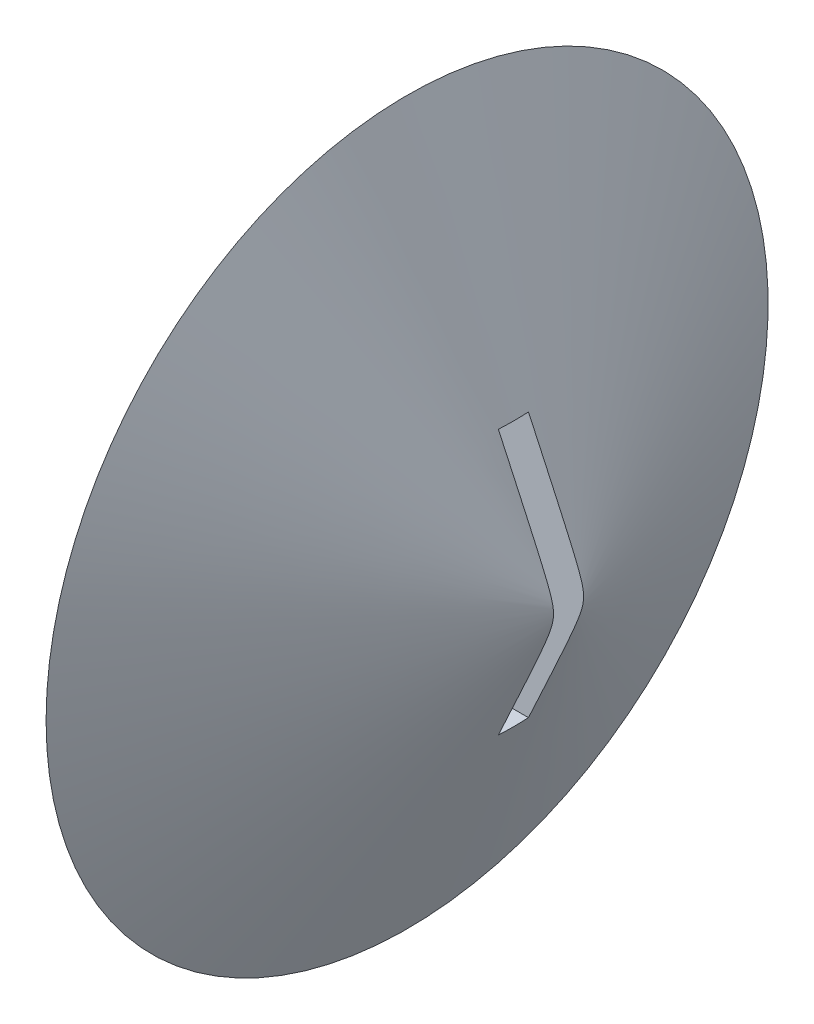
ISO-10303-21;
HEADER;
FILE_DESCRIPTION(('STEP AP214'),'2;1');
FILE_NAME('part.step','',(''),(''),'','','');
FILE_SCHEMA(('AUTOMOTIVE_DESIGN { 1 0 10303 214 1 1 1 1 }'));
ENDSEC;
DATA;
#1=APPLICATION_CONTEXT('core data for automotive mechanical design processes');
#2=APPLICATION_PROTOCOL_DEFINITION('international standard','automotive_design',2000,#1);
#3=PRODUCT_CONTEXT('',#1,'mechanical');
#4=PRODUCT('Part','Part','',(#3));
#5=PRODUCT_RELATED_PRODUCT_CATEGORY('part','',(#4));
#6=PRODUCT_DEFINITION_FORMATION('','',#4);
#7=PRODUCT_DEFINITION_CONTEXT('part definition',#1,'design');
#8=PRODUCT_DEFINITION('design','',#6,#7);
#9=PRODUCT_DEFINITION_SHAPE('','',#8);
#10=(LENGTH_UNIT() NAMED_UNIT(*) SI_UNIT(.MILLI.,.METRE.));
#11=(NAMED_UNIT(*) PLANE_ANGLE_UNIT() SI_UNIT($,.RADIAN.));
#12=(NAMED_UNIT(*) SI_UNIT($,.STERADIAN.) SOLID_ANGLE_UNIT());
#13=UNCERTAINTY_MEASURE_WITH_UNIT(LENGTH_MEASURE(1.E-05),#10,'distance_accuracy_value','');
#14=(GEOMETRIC_REPRESENTATION_CONTEXT(3) GLOBAL_UNCERTAINTY_ASSIGNED_CONTEXT((#13)) GLOBAL_UNIT_ASSIGNED_CONTEXT((#10,
#11,#12)) REPRESENTATION_CONTEXT('',''));
#15=CARTESIAN_POINT('',(0.,0.,0.));
#16=DIRECTION('',(0.,0.,1.));
#17=DIRECTION('',(1.,0.,0.));
#18=AXIS2_PLACEMENT_3D('',#15,#16,#17);
#19=CARTESIAN_POINT('',(0.,0.,0.));
#20=DIRECTION('',(-1.,0.,0.));
#21=DIRECTION('',(0.,0.,1.));
#22=AXIS2_PLACEMENT_3D('',#19,#20,#21);
#23=CONICAL_SURFACE('',#22,0.,1.13416916698135);
#24=CARTESIAN_POINT('',(-8.85895527265695,-11.,-15.4716626533279));
#25=CARTESIAN_POINT('',(-8.76318980882844,-11.,-15.2198639208516));
#26=CARTESIAN_POINT('',(-8.66810490329107,-11.,-14.9678065006942));
#27=CARTESIAN_POINT('',(-8.47946181835994,-11.,-14.4631174713571));
#28=CARTESIAN_POINT('',(-8.38590365871182,-11.,-14.2104858547992));
#29=CARTESIAN_POINT('',(-8.10773684473219,-11.,-13.4515599568466));
#30=CARTESIAN_POINT('',(-7.92567168343597,-11.,-12.9443284635024));
#31=CARTESIAN_POINT('',(-7.56898081356709,-11.,-11.9238783564628));
#32=CARTESIAN_POINT('',(-7.39440547335494,-11.,-11.4106420755648));
#33=CARTESIAN_POINT('',(-7.05613224127399,-11.,-10.3806026814141));
#34=CARTESIAN_POINT('',(-6.89243385618826,-11.,-9.86379973106732));
#35=CARTESIAN_POINT('',(-6.58145175902522,-11.,-8.83453622890365));
#36=CARTESIAN_POINT('',(-6.43394201138863,-11.,-8.32214445080386));
#37=CARTESIAN_POINT('',(-6.15588722354407,-11.,-7.29270656302532));
#38=CARTESIAN_POINT('',(-6.02534296286313,-11.,-6.77566024064676));
#39=CARTESIAN_POINT('',(-5.7858664730821,-11.,-5.73763916405068));
#40=CARTESIAN_POINT('',(-5.67689061046046,-11.,-5.21667460086214));
#41=CARTESIAN_POINT('',(-5.48521409906819,-11.,-4.16995381410837));
#42=CARTESIAN_POINT('',(-5.40250761711072,-11.,-3.64419868101271));
#43=CARTESIAN_POINT('',(-5.28056355059164,-11.,-2.68556253949501));
#44=CARTESIAN_POINT('',(-5.23613386207937,-11.,-2.25334611051981));
#45=CARTESIAN_POINT('',(-5.17014854495112,-11.,-1.38715886160389));
#46=CARTESIAN_POINT('',(-5.14859174444251,-11.,-0.95318813268842));
#47=CARTESIAN_POINT('',(-5.12949465952195,-11.,-0.0847506933162061));
#48=CARTESIAN_POINT('',(-5.13195217115795,-11.,0.349715967966223));
#49=CARTESIAN_POINT('',(-5.1607435193223,-11.,1.21785416474329));
#50=CARTESIAN_POINT('',(-5.18707790965167,-11.,1.65152568156155));
#51=CARTESIAN_POINT('',(-5.26231365405107,-11.,2.51760640773556));
#52=CARTESIAN_POINT('',(-5.31125268841004,-11.,2.95001229149952));
#53=CARTESIAN_POINT('',(-5.42943350929907,-11.,3.81201629545816));
#54=CARTESIAN_POINT('',(-5.49867597642972,-11.,4.24161432103577));
#55=CARTESIAN_POINT('',(-5.65481301466331,-11.,5.0978687653656));
#56=CARTESIAN_POINT('',(-5.74172012659558,-11.,5.52452287036632));
#57=CARTESIAN_POINT('',(-5.93042025168073,-11.,6.37449417638525));
#58=CARTESIAN_POINT('',(-6.03221317114777,-11.,6.79781139838691));
#59=CARTESIAN_POINT('',(-6.23031163080642,-11.,7.57145018957933));
#60=CARTESIAN_POINT('',(-6.32473716150258,-11.,7.9222576861184));
#61=CARTESIAN_POINT('',(-6.52094766544677,-11.,8.62181715282795));
#62=CARTESIAN_POINT('',(-6.62273292546839,-11.,8.97056904232796));
#63=CARTESIAN_POINT('',(-6.83251048189482,-11.,9.66602236172689));
#64=CARTESIAN_POINT('',(-6.94049995956332,-11.,10.0127246450772));
#65=CARTESIAN_POINT('',(-7.16179293872375,-11.,10.7044178291427));
#66=CARTESIAN_POINT('',(-7.27509634543483,-11.,11.0494087602608));
#67=CARTESIAN_POINT('',(-7.50563775016658,-11.,11.736091761476));
#68=CARTESIAN_POINT('',(-7.62285245626019,-11.,12.077791669496));
#69=CARTESIAN_POINT('',(-7.86111999432114,-11.,12.7598507805477));
#70=CARTESIAN_POINT('',(-7.98217284990911,-11.,13.100209975314));
#71=CARTESIAN_POINT('',(-8.22755566096123,-11.,13.7796976025646));
#72=CARTESIAN_POINT('',(-8.3518852304751,-11.,14.1188261746927));
#73=CARTESIAN_POINT('',(-8.60339255489622,-11.,14.7960118622779));
#74=CARTESIAN_POINT('',(-8.7305702037657,-11.,15.1340690170921));
#75=CARTESIAN_POINT('',(-8.85895527265695,-11.,15.4716626533279));
#76=B_SPLINE_CURVE_WITH_KNOTS('',3,(#24,#25,#26,#27,#28,#29,#30,#31,#32,#33,#34,#35,#36,#37,#38,
#39,#40,#41,#42,#43,#44,#45,#46,#47,#48,#49,#50,#51,#52,#53,#54,#55,#56,#57,#58,#59,#60,#61,#62,
#63,#64,#65,#66,#67,#68,#69,#70,#71,#72,#73,#74,#75),.UNSPECIFIED.,.F.,.F.,(4,2,2,2,2,2,2,2,2,2,
2,2,2,2,2,2,2,2,2,2,2,2,2,2,2,4),(0.,0.808182934092733,1.61637631226173,3.2330643776216,
4.85931414896538,6.48549012740686,8.08486958008502,9.68432249478894,11.2805058291761,
12.8763344785556,14.1792708092499,15.4821403807642,16.7848903804548,18.0876705969399,
19.3926303338194,20.6976338198492,22.0035670358594,23.3094920331567,24.3992847186127,
25.4891198910059,26.5784637796436,27.6677882457959,28.7514976325816,29.8352136900011,
30.9188026665885,32.0023513665738),.UNSPECIFIED.);
#77=CARTESIAN_POINT('',(-5.16637095927973,-11.,-1.25));
#78=VERTEX_POINT('',#77);
#79=CARTESIAN_POINT('',(-5.16637095927973,-11.,1.25));
#80=VERTEX_POINT('',#79);
#81=EDGE_CURVE('E131',#78,#80,#76,.T.);
#82=ORIENTED_EDGE('',*,*,#81,.T.);
#83=CARTESIAN_POINT('',(-17.3124348346836,-37.0770096208106,1.25));
#84=CARTESIAN_POINT('',(-16.3849805601676,-35.0884391441067,1.25));
#85=CARTESIAN_POINT('',(-15.4575669489207,-33.0998496992627,1.25));
#86=CARTESIAN_POINT('',(-13.6029697893838,-29.1225261881514,1.25));
#87=CARTESIAN_POINT('',(-12.6757862448635,-27.1337921201264,1.25));
#88=CARTESIAN_POINT('',(-10.8135059054493,-23.138282074427,1.25));
#89=CARTESIAN_POINT('',(-9.87841278405861,-21.1315043840271,1.25));
#90=CARTESIAN_POINT('',(-8.47651475769775,-18.1210109212635,1.25));
#91=CARTESIAN_POINT('',(-8.00934255280038,-17.1174661981866,1.25));
#92=CARTESIAN_POINT('',(-7.07541100702596,-15.110184732549,1.25));
#93=CARTESIAN_POINT('',(-6.60865166609911,-14.1064479900115,1.25));
#94=CARTESIAN_POINT('',(-5.81211509748557,-12.3918258187141,1.25));
#95=CARTESIAN_POINT('',(-5.48214575025017,-11.6810296440729,1.25));
#96=CARTESIAN_POINT('',(-4.82284169838438,-10.2591126833509,1.25));
#97=CARTESIAN_POINT('',(-4.49350701626087,-9.54799188682537,1.25));
#98=CARTESIAN_POINT('',(-4.00114576460425,-8.48241536577092,1.25));
#99=CARTESIAN_POINT('',(-3.83765213687613,-8.12817549351663,1.25));
#100=CARTESIAN_POINT('',(-3.51112187552421,-7.41948519028863,1.25));
#101=CARTESIAN_POINT('',(-3.34808524174187,-7.06503475938801,1.25));
#102=CARTESIAN_POINT('',(-3.02272853642592,-6.35584856128883,1.25));
#103=CARTESIAN_POINT('',(-2.86040839402539,-6.00111282660711,1.25));
#104=CARTESIAN_POINT('',(-2.53690253403351,-5.29112505479507,1.25));
#105=CARTESIAN_POINT('',(-2.37571681101259,-4.9358730201457,1.25));
#106=CARTESIAN_POINT('',(-2.10032746999429,-4.32415219660242,1.25));
#107=CARTESIAN_POINT('',(-1.98562061077827,-4.06791007585177,1.25));
#108=CARTESIAN_POINT('',(-1.75796671467637,-3.55455988857681,1.25));
#109=CARTESIAN_POINT('',(-1.64502014733219,-3.29745161252529,1.25));
#110=CARTESIAN_POINT('',(-1.47758130512037,-2.90946690363672,1.25));
#111=CARTESIAN_POINT('',(-1.42184000609771,-2.77913039509834,1.25));
#112=CARTESIAN_POINT('',(-1.31160304866486,-2.51793263407687,1.25));
#113=CARTESIAN_POINT('',(-1.25710736361483,-2.38707139288668,1.25));
#114=CARTESIAN_POINT('',(-1.14998940064018,-2.12464993397285,1.25));
#115=CARTESIAN_POINT('',(-1.09736630564862,-1.993090050614,1.25));
#116=CARTESIAN_POINT('',(-0.994989151995124,-1.72885001878175,1.25));
#117=CARTESIAN_POINT('',(-0.945234905798747,-1.59616994418589,1.25));
#118=CARTESIAN_POINT('',(-0.878467198961488,-1.40793419384105,1.25));
#119=CARTESIAN_POINT('',(-0.859464255138653,-1.35308591536529,1.25));
#120=CARTESIAN_POINT('',(-0.82247667918405,-1.24305798273272,1.25));
#121=CARTESIAN_POINT('',(-0.804491849465377,-1.1878783951886,1.25));
#122=CARTESIAN_POINT('',(-0.769780057958509,-1.07709314915199,1.25));
#123=CARTESIAN_POINT('',(-0.753053662036113,-1.0214873112296,1.25));
#124=CARTESIAN_POINT('',(-0.721185941728164,-0.909786151146228,1.25));
#125=CARTESIAN_POINT('',(-0.706045751264269,-0.853690509459611,1.25));
#126=CARTESIAN_POINT('',(-0.664148234457437,-0.686749619522206,1.25));
#127=CARTESIAN_POINT('',(-0.640222959041328,-0.575137502891088,1.25));
#128=CARTESIAN_POINT('',(-0.612895074064359,-0.4063869649964,1.25));
#129=CARTESIAN_POINT('',(-0.605213891522464,-0.349938873057788,1.25));
#130=CARTESIAN_POINT('',(-0.59314228070903,-0.236697005728826,1.25));
#131=CARTESIAN_POINT('',(-0.588751007439342,-0.179903322882569,1.25));
#132=CARTESIAN_POINT('',(-0.583499875988047,-0.0649951717258295,1.25));
#133=CARTESIAN_POINT('',(-0.582713425624564,-0.00687727184449333,1.25));
#134=CARTESIAN_POINT('',(-0.584931701594326,0.109287731415269,1.25));
#135=CARTESIAN_POINT('',(-0.587936644529116,0.16733483055922,1.25));
#136=CARTESIAN_POINT('',(-0.59752313540644,0.283194375541836,1.25));
#137=CARTESIAN_POINT('',(-0.604108847222553,0.341006469101331,1.25));
#138=CARTESIAN_POINT('',(-0.620436819125939,0.456185286885928,1.25));
#139=CARTESIAN_POINT('',(-0.630179657421151,0.513551927556976,1.25));
#140=CARTESIAN_POINT('',(-0.652514938970177,0.628803049888271,1.25));
#141=CARTESIAN_POINT('',(-0.665155991038397,0.686677970974992,1.25));
#142=CARTESIAN_POINT('',(-0.692662410862081,0.801890255159697,1.25));
#143=CARTESIAN_POINT('',(-0.707527780620508,0.859227617773569,1.25));
#144=CARTESIAN_POINT('',(-0.739030846577124,0.973411101688426,1.25));
#145=CARTESIAN_POINT('',(-0.75566860083882,1.03025720682977,1.25));
#146=CARTESIAN_POINT('',(-0.790349627116532,1.14351399802529,1.25));
#147=CARTESIAN_POINT('',(-0.808392855632198,1.19992469749622,1.25));
#148=CARTESIAN_POINT('',(-0.86036958403036,1.35706920172207,1.25));
#149=CARTESIAN_POINT('',(-0.895534265017064,1.45739465541055,1.25));
#150=CARTESIAN_POINT('',(-0.968247680154953,1.65718169431577,1.25));
#151=CARTESIAN_POINT('',(-1.00579675082369,1.7566431553322,1.25));
#152=CARTESIAN_POINT('',(-1.08255779654362,1.95496456323651,1.25));
#153=CARTESIAN_POINT('',(-1.12177041563282,2.05382425990002,1.25));
#154=CARTESIAN_POINT('',(-1.20137255703762,2.25106969466546,1.25));
#155=CARTESIAN_POINT('',(-1.24176211110857,2.34945541989535,1.25));
#156=CARTESIAN_POINT('',(-1.36426261902851,2.64423369985143,1.25));
#157=CARTESIAN_POINT('',(-1.44764576932394,2.84009653339566,1.25));
#158=CARTESIAN_POINT('',(-1.61631379385878,3.23093849368212,1.25));
#159=CARTESIAN_POINT('',(-1.70159819945519,3.42591782424918,1.25));
#160=CARTESIAN_POINT('',(-1.87277039100501,3.81395891872902,1.25));
#161=CARTESIAN_POINT('',(-1.95864959789882,4.00702447039255,1.25));
#162=CARTESIAN_POINT('',(-2.13120561894872,4.39281278657595,1.25));
#163=CARTESIAN_POINT('',(-2.21788248330208,4.58553552859914,1.25));
#164=CARTESIAN_POINT('',(-2.39173520227288,4.97061370634222,1.25));
#165=CARTESIAN_POINT('',(-2.47891071910573,5.16296929465701,1.25));
#166=CARTESIAN_POINT('',(-2.65365975970369,5.5474947256811,1.25));
#167=CARTESIAN_POINT('',(-2.7412332752848,5.73966457211214,1.25));
#168=CARTESIAN_POINT('',(-3.00415709604759,6.31545522909357,1.25));
#169=CARTESIAN_POINT('',(-3.17994562812177,6.6988758751696,1.25));
#170=CARTESIAN_POINT('',(-3.53221774360024,7.46539784714072,1.25));
#171=CARTESIAN_POINT('',(-3.70870132776212,7.8484991726872,1.25));
#172=CARTESIAN_POINT('',(-4.23881584915133,8.99750621236566,1.25));
#173=CARTESIAN_POINT('',(-4.59310700099391,9.7631072389436,1.25));
#174=CARTESIAN_POINT('',(-5.30260328695254,11.2941002939688,1.25));
#175=CARTESIAN_POINT('',(-5.65780861351171,12.0594922331201,1.25));
#176=CARTESIAN_POINT('',(-6.36869935766898,13.5900497310815,1.25));
#177=CARTESIAN_POINT('',(-6.72438477350263,14.3552152907109,1.25));
#178=CARTESIAN_POINT('',(-7.43682017806168,15.8870676749479,1.25));
#179=CARTESIAN_POINT('',(-7.79357080354234,16.6537542033242,1.25));
#180=CARTESIAN_POINT('',(-8.50726833108848,18.187036812248,1.25));
#181=CARTESIAN_POINT('',(-8.86421523334624,18.9536328927061,1.25));
#182=CARTESIAN_POINT('',(-9.93520914272829,21.2532306694693,1.25));
#183=CARTESIAN_POINT('',(-10.6494549031593,22.7861397943303,1.25));
#184=CARTESIAN_POINT('',(-11.8598026545931,25.3831590700786,1.25));
#185=CARTESIAN_POINT('',(-12.3558320351622,26.4473030671955,1.25));
#186=CARTESIAN_POINT('',(-13.3479970678245,28.5755654392233,1.25));
#187=CARTESIAN_POINT('',(-13.8441327217109,29.6396838132984,1.25));
#188=CARTESIAN_POINT('',(-14.8356048911008,31.7660268244723,1.25));
#189=CARTESIAN_POINT('',(-15.3309412861808,32.8282515177246,1.25));
#190=CARTESIAN_POINT('',(-16.3216573631876,34.9526568296151,1.25));
#191=CARTESIAN_POINT('',(-16.8170370441458,36.014837448705,1.25));
#192=CARTESIAN_POINT('',(-17.3124348346836,37.0770096208106,1.25));
#193=B_SPLINE_CURVE_WITH_KNOTS('',3,(#83,#84,#85,#86,#87,#88,#89,#90,#91,#92,#93,#94,#95,#96,
#97,#98,#99,#100,#101,#102,#103,#104,#105,#106,#107,#108,#109,#110,#111,#112,#113,#114,#115,
#116,#117,#118,#119,#120,#121,#122,#123,#124,#125,#126,#127,#128,#129,#130,#131,#132,#133,#134,
#135,#136,#137,#138,#139,#140,#141,#142,#143,#144,#145,#146,#147,#148,#149,#150,#151,#152,#153,
#154,#155,#156,#157,#158,#159,#160,#161,#162,#163,#164,#165,#166,#167,#168,#169,#170,#171,#172,
#173,#174,#175,#176,#177,#178,#179,#180,#181,#182,#183,#184,#185,#186,#187,#188,#189,#190,#191,
#192),.UNSPECIFIED.,.F.,.F.,(4,2,2,2,2,2,2,2,2,2,2,2,2,2,2,2,2,2,2,2,2,2,2,2,2,2,2,2,2,2,2,2,2,
2,2,2,2,2,2,2,2,2,2,2,2,2,2,2,2,2,2,2,2,2,4),(0.,6.58264807687481,13.1653977028465,
19.8072348287862,23.1281031960165,26.4489711624711,28.7999280454313,31.1509668192915,
32.3214129142726,33.4918586031644,34.662185807784,35.8325074071583,36.674739619247,
37.5171927712013,37.9424561680617,38.3677104613264,38.7927768696661,39.2178154601681,
39.3919483440472,39.5660473170219,39.7402241129625,39.9145245840735,40.2564656466279,
40.4272917858072,40.5980740340178,40.7723190411013,40.946574003218,41.1210320312934,
41.2955220283389,41.4731858706347,41.650849872915,41.8285196972781,42.0061840248268,
42.3250611279984,42.6439833359073,42.9630301609744,43.2820856023594,43.920682982174,
44.5591246566441,45.1930348478397,45.8269852081305,46.4605476554936,47.0940971333762,
48.3594877537884,49.6248797538249,52.1556893339314,54.6870842683812,57.2184699245098,
59.7553406420407,62.292213849339,67.3656363481595,70.8878555812295,74.4101398509149,
77.9262620018398,81.4423192042753),.UNSPECIFIED.);
#194=CARTESIAN_POINT('',(-5.16637095927973,11.,1.25));
#195=VERTEX_POINT('',#194);
#196=EDGE_CURVE('E43',#80,#195,#193,.T.);
#197=ORIENTED_EDGE('',*,*,#196,.T.);
#198=CARTESIAN_POINT('',(-8.85895527265696,11.,15.4716626533279));
#199=CARTESIAN_POINT('',(-8.76318980882844,11.,15.2198639208516));
#200=CARTESIAN_POINT('',(-8.66810490329107,11.,14.9678065006942));
#201=CARTESIAN_POINT('',(-8.47946181835994,11.,14.4631174713571));
#202=CARTESIAN_POINT('',(-8.38590365871182,11.,14.2104858547992));
#203=CARTESIAN_POINT('',(-8.10773684473219,11.,13.4515599568466));
#204=CARTESIAN_POINT('',(-7.92567168343597,11.,12.9443284635024));
#205=CARTESIAN_POINT('',(-7.5689808135671,11.,11.9238783564628));
#206=CARTESIAN_POINT('',(-7.39440547335494,11.,11.4106420755648));
#207=CARTESIAN_POINT('',(-7.05613224127399,11.,10.3806026814141));
#208=CARTESIAN_POINT('',(-6.89243385618826,11.,9.86379973106733));
#209=CARTESIAN_POINT('',(-6.58145175902522,11.,8.83453622890365));
#210=CARTESIAN_POINT('',(-6.43394201138863,11.,8.32214445080386));
#211=CARTESIAN_POINT('',(-6.15588722354407,11.,7.29270656302532));
#212=CARTESIAN_POINT('',(-6.02534296286314,11.,6.77566024064676));
#213=CARTESIAN_POINT('',(-5.7858664730821,11.,5.73763916405068));
#214=CARTESIAN_POINT('',(-5.67689061046046,11.,5.21667460086215));
#215=CARTESIAN_POINT('',(-5.48521409906819,11.,4.16995381410838));
#216=CARTESIAN_POINT('',(-5.40250761711072,11.,3.64419868101271));
#217=CARTESIAN_POINT('',(-5.28056355059164,11.,2.68556253949501));
#218=CARTESIAN_POINT('',(-5.23613386207937,11.,2.25334611051982));
#219=CARTESIAN_POINT('',(-5.17014854495112,11.,1.38715886160389));
#220=CARTESIAN_POINT('',(-5.14859174444251,11.,0.95318813268842));
#221=CARTESIAN_POINT('',(-5.12949465952195,11.,0.0847506933162046));
#222=CARTESIAN_POINT('',(-5.13195217115795,11.,-0.349715967966225));
#223=CARTESIAN_POINT('',(-5.1607435193223,11.,-1.2178541647433));
#224=CARTESIAN_POINT('',(-5.18707790965167,11.,-1.65152568156156));
#225=CARTESIAN_POINT('',(-5.26231365405107,11.,-2.51760640773557));
#226=CARTESIAN_POINT('',(-5.31125268841004,11.,-2.95001229149952));
#227=CARTESIAN_POINT('',(-5.42943350929907,11.,-3.81201629545816));
#228=CARTESIAN_POINT('',(-5.49867597642972,11.,-4.24161432103577));
#229=CARTESIAN_POINT('',(-5.65481301466331,11.,-5.0978687653656));
#230=CARTESIAN_POINT('',(-5.74172012659558,11.,-5.52452287036632));
#231=CARTESIAN_POINT('',(-5.93042025168073,11.,-6.37449417638525));
#232=CARTESIAN_POINT('',(-6.03221317114777,11.,-6.79781139838691));
#233=CARTESIAN_POINT('',(-6.23031163080642,11.,-7.57145018957933));
#234=CARTESIAN_POINT('',(-6.32473716150258,11.,-7.9222576861184));
#235=CARTESIAN_POINT('',(-6.52094766544677,11.,-8.62181715282795));
#236=CARTESIAN_POINT('',(-6.62273292546839,11.,-8.97056904232796));
#237=CARTESIAN_POINT('',(-6.83251048189482,11.,-9.66602236172689));
#238=CARTESIAN_POINT('',(-6.94049995956332,11.,-10.0127246450772));
#239=CARTESIAN_POINT('',(-7.16179293872375,11.,-10.7044178291427));
#240=CARTESIAN_POINT('',(-7.27509634543483,11.,-11.0494087602608));
#241=CARTESIAN_POINT('',(-7.50563775016658,11.,-11.736091761476));
#242=CARTESIAN_POINT('',(-7.62285245626019,11.,-12.077791669496));
#243=CARTESIAN_POINT('',(-7.86111999432113,11.,-12.7598507805477));
#244=CARTESIAN_POINT('',(-7.98217284990911,11.,-13.100209975314));
#245=CARTESIAN_POINT('',(-8.22755566096123,11.,-13.7796976025646));
#246=CARTESIAN_POINT('',(-8.3518852304751,11.,-14.1188261746927));
#247=CARTESIAN_POINT('',(-8.60339255489622,11.,-14.7960118622779));
#248=CARTESIAN_POINT('',(-8.7305702037657,11.,-15.1340690170921));
#249=CARTESIAN_POINT('',(-8.85895527265695,11.,-15.4716626533279));
#250=B_SPLINE_CURVE_WITH_KNOTS('',3,(#198,#199,#200,#201,#202,#203,#204,#205,#206,#207,#208,
#209,#210,#211,#212,#213,#214,#215,#216,#217,#218,#219,#220,#221,#222,#223,#224,#225,#226,#227,
#228,#229,#230,#231,#232,#233,#234,#235,#236,#237,#238,#239,#240,#241,#242,#243,#244,#245,#246,
#247,#248,#249),.UNSPECIFIED.,.F.,.F.,(4,2,2,2,2,2,2,2,2,2,2,2,2,2,2,2,2,2,2,2,2,2,2,2,2,4),(0.,
0.808182934092732,1.61637631226173,3.2330643776216,4.85931414896537,6.48549012740686,
8.08486958008502,9.68432249478895,11.2805058291761,12.8763344785556,14.1792708092499,
15.4821403807642,16.7848903804548,18.0876705969399,19.3926303338194,20.6976338198492,
22.0035670358594,23.3094920331567,24.3992847186127,25.4891198910059,26.5784637796436,
27.6677882457959,28.7514976325816,29.8352136900011,30.9188026665884,32.0023513665737),.UNSPECIFIED.);
#251=CARTESIAN_POINT('',(-5.16637095927973,11.,-1.25));
#252=VERTEX_POINT('',#251);
#253=EDGE_CURVE('E102',#195,#252,#250,.T.);
#254=ORIENTED_EDGE('',*,*,#253,.T.);
#255=CARTESIAN_POINT('',(-17.3124348346836,37.0770096208106,-1.25));
#256=CARTESIAN_POINT('',(-16.3849805601676,35.0884391441067,-1.25));
#257=CARTESIAN_POINT('',(-15.4575669489207,33.0998496992627,-1.25));
#258=CARTESIAN_POINT('',(-13.6029697893838,29.1225261881514,-1.25));
#259=CARTESIAN_POINT('',(-12.6757862448635,27.1337921201263,-1.25));
#260=CARTESIAN_POINT('',(-10.8135059054493,23.138282074427,-1.25));
#261=CARTESIAN_POINT('',(-9.87841278405861,21.1315043840271,-1.25));
#262=CARTESIAN_POINT('',(-8.47651475769775,18.1210109212635,-1.25));
#263=CARTESIAN_POINT('',(-8.00934255280038,17.1174661981866,-1.25));
#264=CARTESIAN_POINT('',(-7.07541100702596,15.110184732549,-1.25));
#265=CARTESIAN_POINT('',(-6.60865166609911,14.1064479900115,-1.25));
#266=CARTESIAN_POINT('',(-5.81211509748557,12.3918258187141,-1.25));
#267=CARTESIAN_POINT('',(-5.48214575025017,11.6810296440729,-1.25));
#268=CARTESIAN_POINT('',(-4.82284169838438,10.259112683351,-1.25));
#269=CARTESIAN_POINT('',(-4.49350701626087,9.54799188682538,-1.25));
#270=CARTESIAN_POINT('',(-4.00114576460426,8.48241536577093,-1.25));
#271=CARTESIAN_POINT('',(-3.83765213687613,8.12817549351664,-1.25));
#272=CARTESIAN_POINT('',(-3.51112187552421,7.41948519028864,-1.25));
#273=CARTESIAN_POINT('',(-3.34808524174188,7.06503475938802,-1.25));
#274=CARTESIAN_POINT('',(-3.02272853642593,6.35584856128885,-1.25));
#275=CARTESIAN_POINT('',(-2.8604083940254,6.00111282660713,-1.25));
#276=CARTESIAN_POINT('',(-2.53690253403352,5.29112505479509,-1.25));
#277=CARTESIAN_POINT('',(-2.37571681101259,4.93587302014572,-1.25));
#278=CARTESIAN_POINT('',(-2.1003274699943,4.32415219660243,-1.25));
#279=CARTESIAN_POINT('',(-1.98562061077827,4.06791007585179,-1.25));
#280=CARTESIAN_POINT('',(-1.75796671467637,3.55455988857683,-1.25));
#281=CARTESIAN_POINT('',(-1.64502014733219,3.2974516125253,-1.25));
#282=CARTESIAN_POINT('',(-1.47758130512037,2.90946690363674,-1.25));
#283=CARTESIAN_POINT('',(-1.42184000609771,2.77913039509835,-1.25));
#284=CARTESIAN_POINT('',(-1.31160304866486,2.51793263407688,-1.25));
#285=CARTESIAN_POINT('',(-1.25710736361483,2.38707139288669,-1.25));
#286=CARTESIAN_POINT('',(-1.14998940064018,2.12464993397285,-1.25));
#287=CARTESIAN_POINT('',(-1.09736630564862,1.993090050614,-1.25));
#288=CARTESIAN_POINT('',(-0.994989151995123,1.72885001878175,-1.25));
#289=CARTESIAN_POINT('',(-0.945234905798746,1.5961699441859,-1.25));
#290=CARTESIAN_POINT('',(-0.878467198961489,1.40793419384105,-1.25));
#291=CARTESIAN_POINT('',(-0.859464255138655,1.35308591536529,-1.25));
#292=CARTESIAN_POINT('',(-0.822476679184051,1.24305798273273,-1.25));
#293=CARTESIAN_POINT('',(-0.804491849465378,1.18787839518861,-1.25));
#294=CARTESIAN_POINT('',(-0.769780057958508,1.077093149152,-1.25));
#295=CARTESIAN_POINT('',(-0.753053662036113,1.0214873112296,-1.25));
#296=CARTESIAN_POINT('',(-0.721185941728163,0.909786151146232,-1.25));
#297=CARTESIAN_POINT('',(-0.706045751264268,0.853690509459615,-1.25));
#298=CARTESIAN_POINT('',(-0.664148234457436,0.68674961952221,-1.25));
#299=CARTESIAN_POINT('',(-0.640222959041327,0.575137502891092,-1.25));
#300=CARTESIAN_POINT('',(-0.612895074064357,0.406386964996403,-1.25));
#301=CARTESIAN_POINT('',(-0.605213891522463,0.349938873057792,-1.25));
#302=CARTESIAN_POINT('',(-0.593142280709028,0.23669700572883,-1.25));
#303=CARTESIAN_POINT('',(-0.588751007439341,0.179903322882573,-1.25));
#304=CARTESIAN_POINT('',(-0.583499875988046,0.0649951717258356,-1.25));
#305=CARTESIAN_POINT('',(-0.582713425624562,0.00687727184450174,-1.25));
#306=CARTESIAN_POINT('',(-0.584931701594323,-0.109287731415261,-1.25));
#307=CARTESIAN_POINT('',(-0.587936644529114,-0.167334830559214,-1.25));
#308=CARTESIAN_POINT('',(-0.597523135406438,-0.283194375541833,-1.25));
#309=CARTESIAN_POINT('',(-0.604108847222551,-0.341006469101328,-1.25));
#310=CARTESIAN_POINT('',(-0.620436819125937,-0.456185286885925,-1.25));
#311=CARTESIAN_POINT('',(-0.630179657421149,-0.513551927556973,-1.25));
#312=CARTESIAN_POINT('',(-0.652514938970175,-0.628803049888269,-1.25));
#313=CARTESIAN_POINT('',(-0.665155991038395,-0.68667797097499,-1.25));
#314=CARTESIAN_POINT('',(-0.692662410862078,-0.801890255159695,-1.25));
#315=CARTESIAN_POINT('',(-0.707527780620505,-0.859227617773565,-1.25));
#316=CARTESIAN_POINT('',(-0.739030846577121,-0.973411101688419,-1.25));
#317=CARTESIAN_POINT('',(-0.755668600838816,-1.03025720682976,-1.25));
#318=CARTESIAN_POINT('',(-0.790349627116529,-1.14351399802529,-1.25));
#319=CARTESIAN_POINT('',(-0.808392855632195,-1.19992469749622,-1.25));
#320=CARTESIAN_POINT('',(-0.860369584030358,-1.35706920172206,-1.25));
#321=CARTESIAN_POINT('',(-0.895534265017062,-1.45739465541054,-1.25));
#322=CARTESIAN_POINT('',(-0.96824768015495,-1.65718169431577,-1.25));
#323=CARTESIAN_POINT('',(-1.00579675082368,-1.75664315533219,-1.25));
#324=CARTESIAN_POINT('',(-1.08255779654361,-1.9549645632365,-1.25));
#325=CARTESIAN_POINT('',(-1.12177041563282,-2.05382425990001,-1.25));
#326=CARTESIAN_POINT('',(-1.20137255703761,-2.25106969466545,-1.25));
#327=CARTESIAN_POINT('',(-1.24176211110857,-2.34945541989535,-1.25));
#328=CARTESIAN_POINT('',(-1.36426261902851,-2.64423369985142,-1.25));
#329=CARTESIAN_POINT('',(-1.44764576932393,-2.84009653339565,-1.25));
#330=CARTESIAN_POINT('',(-1.61631379385878,-3.2309384936821,-1.25));
#331=CARTESIAN_POINT('',(-1.70159819945518,-3.42591782424916,-1.25));
#332=CARTESIAN_POINT('',(-1.87277039100501,-3.81395891872901,-1.25));
#333=CARTESIAN_POINT('',(-1.95864959789882,-4.00702447039254,-1.25));
#334=CARTESIAN_POINT('',(-2.13120561894871,-4.39281278657594,-1.25));
#335=CARTESIAN_POINT('',(-2.21788248330207,-4.58553552859913,-1.25));
#336=CARTESIAN_POINT('',(-2.39173520227287,-4.9706137063422,-1.25));
#337=CARTESIAN_POINT('',(-2.47891071910572,-5.16296929465699,-1.25));
#338=CARTESIAN_POINT('',(-2.65365975970368,-5.54749472568108,-1.25));
#339=CARTESIAN_POINT('',(-2.74123327528479,-5.73966457211212,-1.25));
#340=CARTESIAN_POINT('',(-3.00415709604758,-6.31545522909355,-1.25));
#341=CARTESIAN_POINT('',(-3.17994562812176,-6.69887587516958,-1.25));
#342=CARTESIAN_POINT('',(-3.53221774360023,-7.46539784714069,-1.25));
#343=CARTESIAN_POINT('',(-3.70870132776211,-7.84849917268717,-1.25));
#344=CARTESIAN_POINT('',(-4.23881584915132,-8.99750621236563,-1.25));
#345=CARTESIAN_POINT('',(-4.5931070009939,-9.76310723894358,-1.25));
#346=CARTESIAN_POINT('',(-5.30260328695252,-11.2941002939687,-1.25));
#347=CARTESIAN_POINT('',(-5.65780861351169,-12.0594922331201,-1.25));
#348=CARTESIAN_POINT('',(-6.36869935766896,-13.5900497310814,-1.25));
#349=CARTESIAN_POINT('',(-6.7243847735026,-14.3552152907108,-1.25));
#350=CARTESIAN_POINT('',(-7.43682017806165,-15.8870676749478,-1.25));
#351=CARTESIAN_POINT('',(-7.79357080354231,-16.6537542033241,-1.25));
#352=CARTESIAN_POINT('',(-8.50726833108845,-18.187036812248,-1.25));
#353=CARTESIAN_POINT('',(-8.86421523334621,-18.9536328927061,-1.25));
#354=CARTESIAN_POINT('',(-9.93520914272825,-21.2532306694692,-1.25));
#355=CARTESIAN_POINT('',(-10.6494549031593,-22.7861397943302,-1.25));
#356=CARTESIAN_POINT('',(-11.8598026545931,-25.3831590700786,-1.25));
#357=CARTESIAN_POINT('',(-12.3558320351622,-26.4473030671954,-1.25));
#358=CARTESIAN_POINT('',(-13.3479970678245,-28.5755654392233,-1.25));
#359=CARTESIAN_POINT('',(-13.8441327217109,-29.6396838132983,-1.25));
#360=CARTESIAN_POINT('',(-14.8356048911008,-31.7660268244723,-1.25));
#361=CARTESIAN_POINT('',(-15.3309412861808,-32.8282515177245,-1.25));
#362=CARTESIAN_POINT('',(-16.3216573631876,-34.9526568296151,-1.25));
#363=CARTESIAN_POINT('',(-16.8170370441458,-36.014837448705,-1.25));
#364=CARTESIAN_POINT('',(-17.3124348346836,-37.0770096208106,-1.25));
#365=B_SPLINE_CURVE_WITH_KNOTS('',3,(#255,#256,#257,#258,#259,#260,#261,#262,#263,#264,#265,
#266,#267,#268,#269,#270,#271,#272,#273,#274,#275,#276,#277,#278,#279,#280,#281,#282,#283,#284,
#285,#286,#287,#288,#289,#290,#291,#292,#293,#294,#295,#296,#297,#298,#299,#300,#301,#302,#303,
#304,#305,#306,#307,#308,#309,#310,#311,#312,#313,#314,#315,#316,#317,#318,#319,#320,#321,#322,
#323,#324,#325,#326,#327,#328,#329,#330,#331,#332,#333,#334,#335,#336,#337,#338,#339,#340,#341,
#342,#343,#344,#345,#346,#347,#348,#349,#350,#351,#352,#353,#354,#355,#356,#357,#358,#359,#360,
#361,#362,#363,#364),.UNSPECIFIED.,.F.,.F.,(4,2,2,2,2,2,2,2,2,2,2,2,2,2,2,2,2,2,2,2,2,2,2,2,2,2,
2,2,2,2,2,2,2,2,2,2,2,2,2,2,2,2,2,2,2,2,2,2,2,2,2,2,2,2,4),(0.,6.58264807687482,
13.1653977028465,19.8072348287862,23.1281031960165,26.4489711624711,28.7999280454313,
31.1509668192915,32.3214129142726,33.4918586031644,34.662185807784,35.8325074071583,
36.674739619247,37.5171927712013,37.9424561680617,38.3677104613264,38.7927768696661,
39.2178154601681,39.3919483440472,39.566047317022,39.7402241129625,39.9145245840735,
40.2564656466279,40.4272917858072,40.5980740340178,40.7723190411013,40.946574003218,
41.1210320312934,41.2955220283389,41.4731858706347,41.650849872915,41.8285196972781,
42.0061840248268,42.3250611279984,42.6439833359073,42.9630301609744,43.2820856023593,
43.920682982174,44.5591246566441,45.1930348478397,45.8269852081305,46.4605476554936,
47.0940971333761,48.3594877537883,49.6248797538249,52.1556893339314,54.6870842683812,
57.2184699245098,59.7553406420407,62.2922138493389,67.3656363481594,70.8878555812295,
74.4101398509148,77.9262620018398,81.4423192042753),.UNSPECIFIED.);
#366=EDGE_CURVE('E82',#252,#78,#365,.T.);
#367=ORIENTED_EDGE('',*,*,#366,.T.);
#368=EDGE_LOOP('',(#82,#197,#254,#367));
#369=FACE_BOUND('',#368,.T.);
#370=CARTESIAN_POINT('',(-14.,0.,0.));
#371=DIRECTION('',(-1.,0.,0.));
#372=DIRECTION('',(0.,0.,1.));
#373=AXIS2_PLACEMENT_3D('',#370,#371,#372);
#374=CIRCLE('',#373,30.);
#375=CARTESIAN_POINT('',(-14.,0.,30.));
#376=VERTEX_POINT('',#375);
#377=EDGE_CURVE('E11',#376,#376,#374,.T.);
#378=ORIENTED_EDGE('',*,*,#377,.F.);
#379=EDGE_LOOP('',(#378));
#380=FACE_BOUND('',#379,.T.);
#381=ADVANCED_FACE('F35',(#369,#380),#23,.T.);
#382=CARTESIAN_POINT('',(-14.,0.,0.));
#383=DIRECTION('',(1.,0.,0.));
#384=DIRECTION('',(0.,0.,-1.));
#385=AXIS2_PLACEMENT_3D('',#382,#383,#384);
#386=PLANE('',#385);
#387=DIRECTION('',(0.,0.,-1.));
#388=VECTOR('',#387,1.);
#389=CARTESIAN_POINT('',(-14.,11.,1.25));
#390=LINE('',#389,#388);
#391=CARTESIAN_POINT('',(-14.,11.,1.25));
#392=VERTEX_POINT('',#391);
#393=CARTESIAN_POINT('',(-14.,11.,-1.25));
#394=VERTEX_POINT('',#393);
#395=EDGE_CURVE('E88',#392,#394,#390,.T.);
#396=ORIENTED_EDGE('',*,*,#395,.F.);
#397=DIRECTION('',(0.,1.,0.));
#398=VECTOR('',#397,1.);
#399=CARTESIAN_POINT('',(-14.,11.,1.25));
#400=LINE('',#399,#398);
#401=CARTESIAN_POINT('',(-14.,-11.,1.25));
#402=VERTEX_POINT('',#401);
#403=EDGE_CURVE('E58',#402,#392,#400,.T.);
#404=ORIENTED_EDGE('',*,*,#403,.F.);
#405=DIRECTION('',(0.,0.,1.));
#406=VECTOR('',#405,1.);
#407=CARTESIAN_POINT('',(-14.,-11.,1.25));
#408=LINE('',#407,#406);
#409=CARTESIAN_POINT('',(-14.,-11.,-1.25));
#410=VERTEX_POINT('',#409);
#411=EDGE_CURVE('E95',#410,#402,#408,.T.);
#412=ORIENTED_EDGE('',*,*,#411,.F.);
#413=DIRECTION('',(0.,-1.,0.));
#414=VECTOR('',#413,1.);
#415=CARTESIAN_POINT('',(-14.,0.,-1.25));
#416=LINE('',#415,#414);
#417=EDGE_CURVE('E79',#394,#410,#416,.T.);
#418=ORIENTED_EDGE('',*,*,#417,.F.);
#419=EDGE_LOOP('',(#396,#404,#412,#418));
#420=FACE_BOUND('',#419,.T.);
#421=ORIENTED_EDGE('',*,*,#377,.T.);
#422=EDGE_LOOP('',(#421));
#423=FACE_BOUND('',#422,.T.);
#424=ADVANCED_FACE('F92',(#420,#423),#386,.F.);
#425=CARTESIAN_POINT('',(0.,11.,1.25));
#426=DIRECTION('',(0.,0.,1.));
#427=DIRECTION('',(1.,0.,0.));
#428=AXIS2_PLACEMENT_3D('',#425,#426,#427);
#429=PLANE('',#428);
#430=DIRECTION('',(-1.,0.,0.));
#431=VECTOR('',#430,1.);
#432=CARTESIAN_POINT('',(0.,-11.,1.25));
#433=LINE('',#432,#431);
#434=EDGE_CURVE('E100',#80,#402,#433,.T.);
#435=ORIENTED_EDGE('',*,*,#434,.T.);
#436=ORIENTED_EDGE('',*,*,#403,.T.);
#437=DIRECTION('',(-1.,0.,0.));
#438=VECTOR('',#437,1.);
#439=CARTESIAN_POINT('',(0.,11.,1.25));
#440=LINE('',#439,#438);
#441=EDGE_CURVE('E85',#195,#392,#440,.T.);
#442=ORIENTED_EDGE('',*,*,#441,.F.);
#443=ORIENTED_EDGE('',*,*,#196,.F.);
#444=EDGE_LOOP('',(#435,#436,#442,#443));
#445=FACE_BOUND('',#444,.T.);
#446=ADVANCED_FACE('F122',(#445),#429,.F.);
#447=CARTESIAN_POINT('',(0.,-11.,1.25));
#448=DIRECTION('',(0.,-1.,0.));
#449=DIRECTION('',(0.,0.,-1.));
#450=AXIS2_PLACEMENT_3D('',#447,#448,#449);
#451=PLANE('',#450);
#452=DIRECTION('',(-1.,0.,0.));
#453=VECTOR('',#452,1.);
#454=CARTESIAN_POINT('',(0.,-11.,-1.25));
#455=LINE('',#454,#453);
#456=EDGE_CURVE('E84',#78,#410,#455,.T.);
#457=ORIENTED_EDGE('',*,*,#456,.T.);
#458=ORIENTED_EDGE('',*,*,#411,.T.);
#459=ORIENTED_EDGE('',*,*,#434,.F.);
#460=ORIENTED_EDGE('',*,*,#81,.F.);
#461=EDGE_LOOP('',(#457,#458,#459,#460));
#462=FACE_BOUND('',#461,.T.);
#463=ADVANCED_FACE('F125',(#462),#451,.F.);
#464=CARTESIAN_POINT('',(0.,0.,-1.25));
#465=DIRECTION('',(0.,0.,-1.));
#466=DIRECTION('',(-1.,0.,0.));
#467=AXIS2_PLACEMENT_3D('',#464,#465,#466);
#468=PLANE('',#467);
#469=DIRECTION('',(-1.,0.,0.));
#470=VECTOR('',#469,1.);
#471=CARTESIAN_POINT('',(0.,11.,-1.25));
#472=LINE('',#471,#470);
#473=EDGE_CURVE('E50',#252,#394,#472,.T.);
#474=ORIENTED_EDGE('',*,*,#473,.T.);
#475=ORIENTED_EDGE('',*,*,#417,.T.);
#476=ORIENTED_EDGE('',*,*,#456,.F.);
#477=ORIENTED_EDGE('',*,*,#366,.F.);
#478=EDGE_LOOP('',(#474,#475,#476,#477));
#479=FACE_BOUND('',#478,.T.);
#480=ADVANCED_FACE('F76',(#479),#468,.F.);
#481=CARTESIAN_POINT('',(0.,11.,1.25));
#482=DIRECTION('',(0.,1.,0.));
#483=DIRECTION('',(0.,0.,1.));
#484=AXIS2_PLACEMENT_3D('',#481,#482,#483);
#485=PLANE('',#484);
#486=ORIENTED_EDGE('',*,*,#441,.T.);
#487=ORIENTED_EDGE('',*,*,#395,.T.);
#488=ORIENTED_EDGE('',*,*,#473,.F.);
#489=ORIENTED_EDGE('',*,*,#253,.F.);
#490=EDGE_LOOP('',(#486,#487,#488,#489));
#491=FACE_BOUND('',#490,.T.);
#492=ADVANCED_FACE('F89',(#491),#485,.F.);
#493=CLOSED_SHELL('',(#381,#424,#446,#463,#480,#492));
#494=MANIFOLD_SOLID_BREP('B2',#493);
#495=ADVANCED_BREP_SHAPE_REPRESENTATION('',(#18,#494),#14);
#496=SHAPE_DEFINITION_REPRESENTATION(#9,#495);
ENDSEC;
END-ISO-10303-21;
